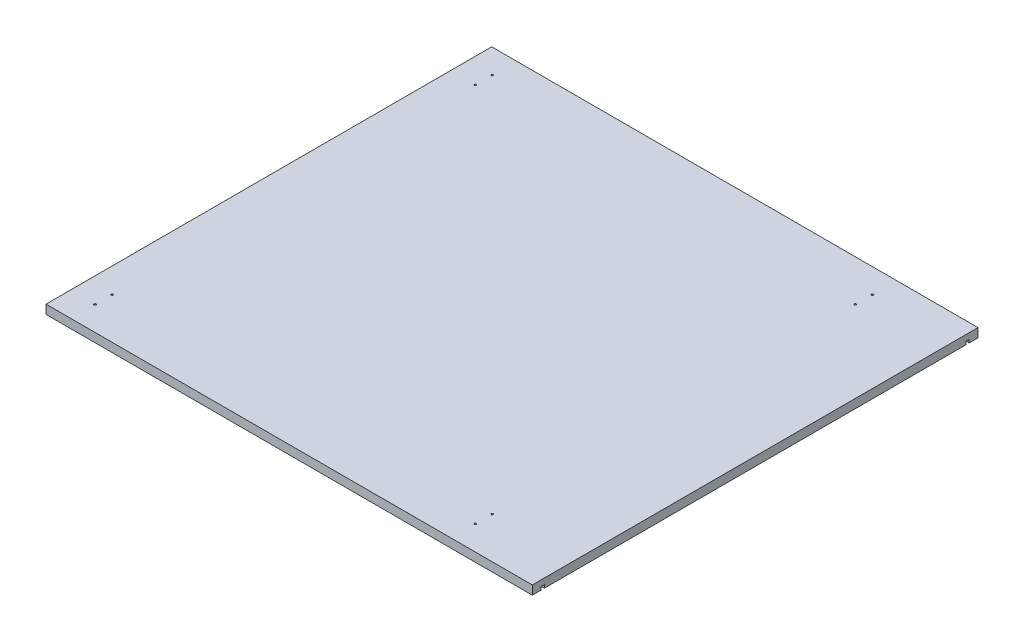
ISO-10303-21;
HEADER;
FILE_DESCRIPTION(('STEP AP214'),'2;1');
FILE_NAME('part.step','',(''),(''),'','','');
FILE_SCHEMA(('AUTOMOTIVE_DESIGN { 1 0 10303 214 1 1 1 1 }'));
ENDSEC;
DATA;
#1=APPLICATION_CONTEXT('core data for automotive mechanical design processes');
#2=APPLICATION_PROTOCOL_DEFINITION('international standard','automotive_design',2000,#1);
#3=PRODUCT_CONTEXT('',#1,'mechanical');
#4=PRODUCT('Part','Part','',(#3));
#5=PRODUCT_RELATED_PRODUCT_CATEGORY('part','',(#4));
#6=PRODUCT_DEFINITION_FORMATION('','',#4);
#7=PRODUCT_DEFINITION_CONTEXT('part definition',#1,'design');
#8=PRODUCT_DEFINITION('design','',#6,#7);
#9=PRODUCT_DEFINITION_SHAPE('','',#8);
#10=(LENGTH_UNIT() NAMED_UNIT(*) SI_UNIT(.MILLI.,.METRE.));
#11=(NAMED_UNIT(*) PLANE_ANGLE_UNIT() SI_UNIT($,.RADIAN.));
#12=(NAMED_UNIT(*) SI_UNIT($,.STERADIAN.) SOLID_ANGLE_UNIT());
#13=UNCERTAINTY_MEASURE_WITH_UNIT(LENGTH_MEASURE(1.E-05),#10,'distance_accuracy_value','');
#14=(GEOMETRIC_REPRESENTATION_CONTEXT(3) GLOBAL_UNCERTAINTY_ASSIGNED_CONTEXT((#13)) GLOBAL_UNIT_ASSIGNED_CONTEXT((#10,
#11,#12)) REPRESENTATION_CONTEXT('',''));
#15=CARTESIAN_POINT('',(0.,0.,0.));
#16=DIRECTION('',(0.,0.,1.));
#17=DIRECTION('',(1.,0.,0.));
#18=AXIS2_PLACEMENT_3D('',#15,#16,#17);
#19=CARTESIAN_POINT('',(0.,0.,0.));
#20=DIRECTION('',(0.,1.,0.));
#21=DIRECTION('',(0.,0.,1.));
#22=AXIS2_PLACEMENT_3D('',#19,#20,#21);
#23=PLANE('',#22);
#24=DIRECTION('',(0.,0.,-1.));
#25=VECTOR('',#24,1.);
#26=CARTESIAN_POINT('',(498.856,0.,457.2));
#27=LINE('',#26,#25);
#28=CARTESIAN_POINT('',(498.856,0.,-438.94375));
#29=VERTEX_POINT('',#28);
#30=CARTESIAN_POINT('',(498.856,0.,-457.2));
#31=VERTEX_POINT('',#30);
#32=EDGE_CURVE('E231',#29,#31,#27,.T.);
#33=ORIENTED_EDGE('',*,*,#32,.F.);
#34=DIRECTION('',(1.,0.,0.));
#35=VECTOR('',#34,1.);
#36=CARTESIAN_POINT('',(-480.59975,0.,-438.94375));
#37=LINE('',#36,#35);
#38=CARTESIAN_POINT('',(-480.59975,0.,-438.94375));
#39=VERTEX_POINT('',#38);
#40=EDGE_CURVE('E154',#39,#29,#37,.T.);
#41=ORIENTED_EDGE('',*,*,#40,.F.);
#42=DIRECTION('',(0.,0.,-1.));
#43=VECTOR('',#42,1.);
#44=CARTESIAN_POINT('',(-480.59975,0.,438.94375));
#45=LINE('',#44,#43);
#46=CARTESIAN_POINT('',(-480.59975,0.,438.94375));
#47=VERTEX_POINT('',#46);
#48=EDGE_CURVE('E176',#47,#39,#45,.T.);
#49=ORIENTED_EDGE('',*,*,#48,.F.);
#50=DIRECTION('',(-1.,0.,0.));
#51=VECTOR('',#50,1.);
#52=CARTESIAN_POINT('',(-480.59975,0.,438.94375));
#53=LINE('',#52,#51);
#54=CARTESIAN_POINT('',(498.856,0.,438.94375));
#55=VERTEX_POINT('',#54);
#56=EDGE_CURVE('E173',#55,#47,#53,.T.);
#57=ORIENTED_EDGE('',*,*,#56,.F.);
#58=CARTESIAN_POINT('',(498.856,0.,457.2));
#59=VERTEX_POINT('',#58);
#60=EDGE_CURVE('E232',#59,#55,#27,.T.);
#61=ORIENTED_EDGE('',*,*,#60,.F.);
#62=DIRECTION('',(1.,0.,0.));
#63=VECTOR('',#62,1.);
#64=CARTESIAN_POINT('',(-498.856,0.,457.2));
#65=LINE('',#64,#63);
#66=CARTESIAN_POINT('',(-498.856,0.,457.2));
#67=VERTEX_POINT('',#66);
#68=EDGE_CURVE('E235',#67,#59,#65,.T.);
#69=ORIENTED_EDGE('',*,*,#68,.F.);
#70=DIRECTION('',(0.,0.,-1.));
#71=VECTOR('',#70,1.);
#72=CARTESIAN_POINT('',(-498.856,0.,457.2));
#73=LINE('',#72,#71);
#74=CARTESIAN_POINT('',(-498.856,0.,-457.2));
#75=VERTEX_POINT('',#74);
#76=EDGE_CURVE('E221',#67,#75,#73,.T.);
#77=ORIENTED_EDGE('',*,*,#76,.T.);
#78=DIRECTION('',(1.,0.,0.));
#79=VECTOR('',#78,1.);
#80=CARTESIAN_POINT('',(-498.856,0.,-457.2));
#81=LINE('',#80,#79);
#82=EDGE_CURVE('E228',#75,#31,#81,.T.);
#83=ORIENTED_EDGE('',*,*,#82,.T.);
#84=EDGE_LOOP('',(#33,#41,#49,#57,#61,#69,#77,#83));
#85=FACE_BOUND('',#84,.T.);
#86=ADVANCED_FACE('F34',(#85),#23,.F.);
#87=CARTESIAN_POINT('',(-498.856,18.25625,-457.2));
#88=DIRECTION('',(0.,0.,-1.));
#89=DIRECTION('',(-1.,0.,0.));
#90=AXIS2_PLACEMENT_3D('',#87,#88,#89);
#91=PLANE('',#90);
#92=ORIENTED_EDGE('',*,*,#82,.F.);
#93=DIRECTION('',(0.,-1.,0.));
#94=VECTOR('',#93,1.);
#95=CARTESIAN_POINT('',(-498.856,18.25625,-457.2));
#96=LINE('',#95,#94);
#97=CARTESIAN_POINT('',(-498.856,18.25625,-457.2));
#98=VERTEX_POINT('',#97);
#99=EDGE_CURVE('E11',#98,#75,#96,.T.);
#100=ORIENTED_EDGE('',*,*,#99,.F.);
#101=DIRECTION('',(1.,0.,0.));
#102=VECTOR('',#101,1.);
#103=CARTESIAN_POINT('',(-498.856,18.25625,-457.2));
#104=LINE('',#103,#102);
#105=CARTESIAN_POINT('',(498.856,18.25625,-457.2));
#106=VERTEX_POINT('',#105);
#107=EDGE_CURVE('E219',#98,#106,#104,.T.);
#108=ORIENTED_EDGE('',*,*,#107,.T.);
#109=DIRECTION('',(0.,-1.,0.));
#110=VECTOR('',#109,1.);
#111=CARTESIAN_POINT('',(498.856,18.25625,-457.2));
#112=LINE('',#111,#110);
#113=EDGE_CURVE('E227',#106,#31,#112,.T.);
#114=ORIENTED_EDGE('',*,*,#113,.T.);
#115=EDGE_LOOP('',(#92,#100,#108,#114));
#116=FACE_BOUND('',#115,.T.);
#117=ADVANCED_FACE('F36',(#116),#91,.T.);
#118=CARTESIAN_POINT('',(-498.856,18.25625,457.2));
#119=DIRECTION('',(-1.,0.,0.));
#120=DIRECTION('',(0.,0.,1.));
#121=AXIS2_PLACEMENT_3D('',#118,#119,#120);
#122=PLANE('',#121);
#123=ORIENTED_EDGE('',*,*,#76,.F.);
#124=DIRECTION('',(0.,-1.,0.));
#125=VECTOR('',#124,1.);
#126=CARTESIAN_POINT('',(-498.856,18.25625,457.2));
#127=LINE('',#126,#125);
#128=CARTESIAN_POINT('',(-498.856,18.25625,457.2));
#129=VERTEX_POINT('',#128);
#130=EDGE_CURVE('E43',#129,#67,#127,.T.);
#131=ORIENTED_EDGE('',*,*,#130,.F.);
#132=DIRECTION('',(0.,0.,-1.));
#133=VECTOR('',#132,1.);
#134=CARTESIAN_POINT('',(-498.856,18.25625,457.2));
#135=LINE('',#134,#133);
#136=EDGE_CURVE('E225',#129,#98,#135,.T.);
#137=ORIENTED_EDGE('',*,*,#136,.T.);
#138=ORIENTED_EDGE('',*,*,#99,.T.);
#139=EDGE_LOOP('',(#123,#131,#137,#138));
#140=FACE_BOUND('',#139,.T.);
#141=ADVANCED_FACE('F292',(#140),#122,.T.);
#142=CARTESIAN_POINT('',(-498.856,18.25625,457.2));
#143=DIRECTION('',(0.,0.,-1.));
#144=DIRECTION('',(-1.,0.,0.));
#145=AXIS2_PLACEMENT_3D('',#142,#143,#144);
#146=PLANE('',#145);
#147=ORIENTED_EDGE('',*,*,#68,.T.);
#148=DIRECTION('',(0.,-1.,0.));
#149=VECTOR('',#148,1.);
#150=CARTESIAN_POINT('',(498.856,18.25625,457.2));
#151=LINE('',#150,#149);
#152=CARTESIAN_POINT('',(498.856,18.25625,457.2));
#153=VERTEX_POINT('',#152);
#154=EDGE_CURVE('E241',#153,#59,#151,.T.);
#155=ORIENTED_EDGE('',*,*,#154,.F.);
#156=DIRECTION('',(1.,0.,0.));
#157=VECTOR('',#156,1.);
#158=CARTESIAN_POINT('',(-498.856,18.25625,457.2));
#159=LINE('',#158,#157);
#160=EDGE_CURVE('E223',#129,#153,#159,.T.);
#161=ORIENTED_EDGE('',*,*,#160,.F.);
#162=ORIENTED_EDGE('',*,*,#130,.T.);
#163=EDGE_LOOP('',(#147,#155,#161,#162));
#164=FACE_BOUND('',#163,.T.);
#165=ADVANCED_FACE('F311',(#164),#146,.F.);
#166=CARTESIAN_POINT('',(498.856,18.25625,457.2));
#167=DIRECTION('',(-1.,0.,0.));
#168=DIRECTION('',(0.,0.,1.));
#169=AXIS2_PLACEMENT_3D('',#166,#167,#168);
#170=PLANE('',#169);
#171=CARTESIAN_POINT('',(498.856,0.,432.59375));
#172=VERTEX_POINT('',#171);
#173=CARTESIAN_POINT('',(498.856,0.,-432.59375));
#174=VERTEX_POINT('',#173);
#175=EDGE_CURVE('E236',#172,#174,#27,.T.);
#176=ORIENTED_EDGE('',*,*,#175,.T.);
#177=DIRECTION('',(0.,-1.,0.));
#178=VECTOR('',#177,1.);
#179=CARTESIAN_POINT('',(498.856,6.35,-432.59375));
#180=LINE('',#179,#178);
#181=CARTESIAN_POINT('',(498.856,6.35,-432.59375));
#182=VERTEX_POINT('',#181);
#183=EDGE_CURVE('E183',#182,#174,#180,.T.);
#184=ORIENTED_EDGE('',*,*,#183,.F.);
#185=DIRECTION('',(0.,0.,1.));
#186=VECTOR('',#185,1.);
#187=CARTESIAN_POINT('',(498.856,6.35,-432.59375));
#188=LINE('',#187,#186);
#189=CARTESIAN_POINT('',(498.856,6.35,-438.94375));
#190=VERTEX_POINT('',#189);
#191=EDGE_CURVE('E167',#190,#182,#188,.T.);
#192=ORIENTED_EDGE('',*,*,#191,.F.);
#193=DIRECTION('',(0.,-1.,0.));
#194=VECTOR('',#193,1.);
#195=CARTESIAN_POINT('',(498.856,6.35,-438.94375));
#196=LINE('',#195,#194);
#197=EDGE_CURVE('E185',#190,#29,#196,.T.);
#198=ORIENTED_EDGE('',*,*,#197,.T.);
#199=ORIENTED_EDGE('',*,*,#32,.T.);
#200=ORIENTED_EDGE('',*,*,#113,.F.);
#201=DIRECTION('',(0.,0.,-1.));
#202=VECTOR('',#201,1.);
#203=CARTESIAN_POINT('',(498.856,18.25625,457.2));
#204=LINE('',#203,#202);
#205=EDGE_CURVE('E84',#153,#106,#204,.T.);
#206=ORIENTED_EDGE('',*,*,#205,.F.);
#207=ORIENTED_EDGE('',*,*,#154,.T.);
#208=ORIENTED_EDGE('',*,*,#60,.T.);
#209=DIRECTION('',(0.,-1.,0.));
#210=VECTOR('',#209,1.);
#211=CARTESIAN_POINT('',(498.856,6.35,438.94375));
#212=LINE('',#211,#210);
#213=CARTESIAN_POINT('',(498.856,6.35,438.94375));
#214=VERTEX_POINT('',#213);
#215=EDGE_CURVE('E192',#214,#55,#212,.T.);
#216=ORIENTED_EDGE('',*,*,#215,.F.);
#217=DIRECTION('',(0.,0.,1.));
#218=VECTOR('',#217,1.);
#219=CARTESIAN_POINT('',(498.856,6.35,438.94375));
#220=LINE('',#219,#218);
#221=CARTESIAN_POINT('',(498.856,6.35,432.59375));
#222=VERTEX_POINT('',#221);
#223=EDGE_CURVE('E147',#222,#214,#220,.T.);
#224=ORIENTED_EDGE('',*,*,#223,.F.);
#225=DIRECTION('',(0.,-1.,0.));
#226=VECTOR('',#225,1.);
#227=CARTESIAN_POINT('',(498.856,6.35,432.59375));
#228=LINE('',#227,#226);
#229=EDGE_CURVE('E137',#222,#172,#228,.T.);
#230=ORIENTED_EDGE('',*,*,#229,.T.);
#231=EDGE_LOOP('',(#176,#184,#192,#198,#199,#200,#206,#207,#208,#216,#224,#230));
#232=FACE_BOUND('',#231,.T.);
#233=ADVANCED_FACE('F306',(#232),#170,.F.);
#234=CARTESIAN_POINT('',(0.,18.25625,0.));
#235=DIRECTION('',(0.,1.,0.));
#236=DIRECTION('',(0.,0.,1.));
#237=AXIS2_PLACEMENT_3D('',#234,#235,#236);
#238=PLANE('',#237);
#239=CARTESIAN_POINT('',(-448.056,18.25625,372.5));
#240=DIRECTION('',(0.,1.,0.));
#241=DIRECTION('',(0.,0.,-1.));
#242=AXIS2_PLACEMENT_3D('',#239,#240,#241);
#243=CIRCLE('',#242,2.);
#244=CARTESIAN_POINT('',(-448.056,18.25625,370.5));
#245=VERTEX_POINT('',#244);
#246=EDGE_CURVE('E201',#245,#245,#243,.T.);
#247=ORIENTED_EDGE('',*,*,#246,.F.);
#248=EDGE_LOOP('',(#247));
#249=FACE_BOUND('',#248,.T.);
#250=CARTESIAN_POINT('',(331.944,18.25625,-407.5));
#251=DIRECTION('',(0.,1.,0.));
#252=DIRECTION('',(0.,0.,-1.));
#253=AXIS2_PLACEMENT_3D('',#250,#251,#252);
#254=CIRCLE('',#253,2.);
#255=CARTESIAN_POINT('',(331.944,18.25625,-409.5));
#256=VERTEX_POINT('',#255);
#257=EDGE_CURVE('E204',#256,#256,#254,.T.);
#258=ORIENTED_EDGE('',*,*,#257,.F.);
#259=EDGE_LOOP('',(#258));
#260=FACE_BOUND('',#259,.T.);
#261=CARTESIAN_POINT('',(-448.056,18.25625,-372.5));
#262=DIRECTION('',(0.,1.,0.));
#263=DIRECTION('',(0.,0.,1.));
#264=AXIS2_PLACEMENT_3D('',#261,#262,#263);
#265=CIRCLE('',#264,2.);
#266=CARTESIAN_POINT('',(-448.056,18.25625,-370.5));
#267=VERTEX_POINT('',#266);
#268=EDGE_CURVE('E207',#267,#267,#265,.T.);
#269=ORIENTED_EDGE('',*,*,#268,.F.);
#270=EDGE_LOOP('',(#269));
#271=FACE_BOUND('',#270,.T.);
#272=CARTESIAN_POINT('',(-448.056,18.25625,-407.5));
#273=DIRECTION('',(0.,1.,0.));
#274=DIRECTION('',(0.,0.,1.));
#275=AXIS2_PLACEMENT_3D('',#272,#273,#274);
#276=CIRCLE('',#275,2.);
#277=CARTESIAN_POINT('',(-448.056,18.25625,-405.5));
#278=VERTEX_POINT('',#277);
#279=EDGE_CURVE('E210',#278,#278,#276,.T.);
#280=ORIENTED_EDGE('',*,*,#279,.F.);
#281=EDGE_LOOP('',(#280));
#282=FACE_BOUND('',#281,.T.);
#283=CARTESIAN_POINT('',(331.944,18.25625,407.5));
#284=DIRECTION('',(0.,1.,0.));
#285=DIRECTION('',(0.,0.,1.));
#286=AXIS2_PLACEMENT_3D('',#283,#284,#285);
#287=CIRCLE('',#286,2.);
#288=CARTESIAN_POINT('',(331.944,18.25625,409.5));
#289=VERTEX_POINT('',#288);
#290=EDGE_CURVE('E182',#289,#289,#287,.T.);
#291=ORIENTED_EDGE('',*,*,#290,.F.);
#292=EDGE_LOOP('',(#291));
#293=FACE_BOUND('',#292,.T.);
#294=CARTESIAN_POINT('',(331.944,18.25625,372.5));
#295=DIRECTION('',(0.,1.,0.));
#296=DIRECTION('',(0.,0.,1.));
#297=AXIS2_PLACEMENT_3D('',#294,#295,#296);
#298=CIRCLE('',#297,2.);
#299=CARTESIAN_POINT('',(331.944,18.25625,374.5));
#300=VERTEX_POINT('',#299);
#301=EDGE_CURVE('E197',#300,#300,#298,.T.);
#302=ORIENTED_EDGE('',*,*,#301,.F.);
#303=EDGE_LOOP('',(#302));
#304=FACE_BOUND('',#303,.T.);
#305=CARTESIAN_POINT('',(-448.056,18.25625,407.5));
#306=DIRECTION('',(0.,1.,0.));
#307=DIRECTION('',(0.,0.,-1.));
#308=AXIS2_PLACEMENT_3D('',#305,#306,#307);
#309=CIRCLE('',#308,2.);
#310=CARTESIAN_POINT('',(-448.056,18.25625,405.5));
#311=VERTEX_POINT('',#310);
#312=EDGE_CURVE('E198',#311,#311,#309,.T.);
#313=ORIENTED_EDGE('',*,*,#312,.F.);
#314=EDGE_LOOP('',(#313));
#315=FACE_BOUND('',#314,.T.);
#316=CARTESIAN_POINT('',(331.944,18.25625,-372.5));
#317=DIRECTION('',(0.,1.,0.));
#318=DIRECTION('',(0.,0.,-1.));
#319=AXIS2_PLACEMENT_3D('',#316,#317,#318);
#320=CIRCLE('',#319,2.);
#321=CARTESIAN_POINT('',(331.944,18.25625,-374.5));
#322=VERTEX_POINT('',#321);
#323=EDGE_CURVE('E213',#322,#322,#320,.T.);
#324=ORIENTED_EDGE('',*,*,#323,.F.);
#325=EDGE_LOOP('',(#324));
#326=FACE_BOUND('',#325,.T.);
#327=ORIENTED_EDGE('',*,*,#107,.F.);
#328=ORIENTED_EDGE('',*,*,#136,.F.);
#329=ORIENTED_EDGE('',*,*,#160,.T.);
#330=ORIENTED_EDGE('',*,*,#205,.T.);
#331=EDGE_LOOP('',(#327,#328,#329,#330));
#332=FACE_BOUND('',#331,.T.);
#333=ADVANCED_FACE('F298',(#249,#260,#271,#282,#293,#304,#315,#326,#332),#238,.T.);
#334=CARTESIAN_POINT('',(-448.056,0.,372.5));
#335=DIRECTION('',(0.,1.,0.));
#336=DIRECTION('',(0.,0.,1.));
#337=AXIS2_PLACEMENT_3D('',#334,#335,#336);
#338=CIRCLE('',#337,2.);
#339=CARTESIAN_POINT('',(-448.056,0.,374.5));
#340=VERTEX_POINT('',#339);
#341=EDGE_CURVE('E38',#340,#340,#338,.T.);
#342=ORIENTED_EDGE('',*,*,#341,.T.);
#343=EDGE_LOOP('',(#342));
#344=FACE_BOUND('',#343,.T.);
#345=CARTESIAN_POINT('',(331.944,0.,-407.5));
#346=DIRECTION('',(0.,1.,0.));
#347=DIRECTION('',(0.,0.,1.));
#348=AXIS2_PLACEMENT_3D('',#345,#346,#347);
#349=CIRCLE('',#348,2.);
#350=CARTESIAN_POINT('',(331.944,0.,-405.5));
#351=VERTEX_POINT('',#350);
#352=EDGE_CURVE('E262',#351,#351,#349,.T.);
#353=ORIENTED_EDGE('',*,*,#352,.T.);
#354=EDGE_LOOP('',(#353));
#355=FACE_BOUND('',#354,.T.);
#356=CARTESIAN_POINT('',(-448.056,0.,-372.5));
#357=DIRECTION('',(0.,1.,0.));
#358=DIRECTION('',(0.,0.,1.));
#359=AXIS2_PLACEMENT_3D('',#356,#357,#358);
#360=CIRCLE('',#359,2.);
#361=CARTESIAN_POINT('',(-448.056,0.,-370.5));
#362=VERTEX_POINT('',#361);
#363=EDGE_CURVE('E260',#362,#362,#360,.T.);
#364=ORIENTED_EDGE('',*,*,#363,.T.);
#365=EDGE_LOOP('',(#364));
#366=FACE_BOUND('',#365,.T.);
#367=CARTESIAN_POINT('',(-448.056,0.,-407.5));
#368=DIRECTION('',(0.,1.,0.));
#369=DIRECTION('',(0.,0.,1.));
#370=AXIS2_PLACEMENT_3D('',#367,#368,#369);
#371=CIRCLE('',#370,2.);
#372=CARTESIAN_POINT('',(-448.056,0.,-405.5));
#373=VERTEX_POINT('',#372);
#374=EDGE_CURVE('E257',#373,#373,#371,.T.);
#375=ORIENTED_EDGE('',*,*,#374,.T.);
#376=EDGE_LOOP('',(#375));
#377=FACE_BOUND('',#376,.T.);
#378=CARTESIAN_POINT('',(331.944,0.,407.5));
#379=DIRECTION('',(0.,1.,0.));
#380=DIRECTION('',(0.,0.,1.));
#381=AXIS2_PLACEMENT_3D('',#378,#379,#380);
#382=CIRCLE('',#381,2.);
#383=CARTESIAN_POINT('',(331.944,0.,409.5));
#384=VERTEX_POINT('',#383);
#385=EDGE_CURVE('E254',#384,#384,#382,.T.);
#386=ORIENTED_EDGE('',*,*,#385,.T.);
#387=EDGE_LOOP('',(#386));
#388=FACE_BOUND('',#387,.T.);
#389=CARTESIAN_POINT('',(331.944,0.,372.5));
#390=DIRECTION('',(0.,1.,0.));
#391=DIRECTION('',(0.,0.,1.));
#392=AXIS2_PLACEMENT_3D('',#389,#390,#391);
#393=CIRCLE('',#392,2.);
#394=CARTESIAN_POINT('',(331.944,0.,374.5));
#395=VERTEX_POINT('',#394);
#396=EDGE_CURVE('E251',#395,#395,#393,.T.);
#397=ORIENTED_EDGE('',*,*,#396,.T.);
#398=EDGE_LOOP('',(#397));
#399=FACE_BOUND('',#398,.T.);
#400=CARTESIAN_POINT('',(-448.056,0.,407.5));
#401=DIRECTION('',(0.,1.,0.));
#402=DIRECTION('',(0.,0.,1.));
#403=AXIS2_PLACEMENT_3D('',#400,#401,#402);
#404=CIRCLE('',#403,2.);
#405=CARTESIAN_POINT('',(-448.056,0.,409.5));
#406=VERTEX_POINT('',#405);
#407=EDGE_CURVE('E248',#406,#406,#404,.T.);
#408=ORIENTED_EDGE('',*,*,#407,.T.);
#409=EDGE_LOOP('',(#408));
#410=FACE_BOUND('',#409,.T.);
#411=CARTESIAN_POINT('',(331.944,0.,-372.5));
#412=DIRECTION('',(0.,1.,0.));
#413=DIRECTION('',(0.,0.,1.));
#414=AXIS2_PLACEMENT_3D('',#411,#412,#413);
#415=CIRCLE('',#414,2.);
#416=CARTESIAN_POINT('',(331.944,0.,-370.5));
#417=VERTEX_POINT('',#416);
#418=EDGE_CURVE('E218',#417,#417,#415,.T.);
#419=ORIENTED_EDGE('',*,*,#418,.T.);
#420=EDGE_LOOP('',(#419));
#421=FACE_BOUND('',#420,.T.);
#422=DIRECTION('',(0.,0.,1.));
#423=VECTOR('',#422,1.);
#424=CARTESIAN_POINT('',(-474.24975,0.,432.59375));
#425=LINE('',#424,#423);
#426=CARTESIAN_POINT('',(-474.24975,0.,-432.59375));
#427=VERTEX_POINT('',#426);
#428=CARTESIAN_POINT('',(-474.24975,0.,432.59375));
#429=VERTEX_POINT('',#428);
#430=EDGE_CURVE('E51',#427,#429,#425,.T.);
#431=ORIENTED_EDGE('',*,*,#430,.F.);
#432=DIRECTION('',(-1.,0.,0.));
#433=VECTOR('',#432,1.);
#434=CARTESIAN_POINT('',(-474.24975,0.,-432.59375));
#435=LINE('',#434,#433);
#436=EDGE_CURVE('E151',#174,#427,#435,.T.);
#437=ORIENTED_EDGE('',*,*,#436,.F.);
#438=ORIENTED_EDGE('',*,*,#175,.F.);
#439=DIRECTION('',(1.,0.,0.));
#440=VECTOR('',#439,1.);
#441=CARTESIAN_POINT('',(-474.24975,0.,432.59375));
#442=LINE('',#441,#440);
#443=EDGE_CURVE('E171',#429,#172,#442,.T.);
#444=ORIENTED_EDGE('',*,*,#443,.F.);
#445=EDGE_LOOP('',(#431,#437,#438,#444));
#446=FACE_BOUND('',#445,.T.);
#447=ADVANCED_FACE('F269',(#344,#355,#366,#377,#388,#399,#410,#421,#446),#23,.F.);
#448=CARTESIAN_POINT('',(331.944,-32.54375,-372.5));
#449=DIRECTION('',(0.,1.,0.));
#450=DIRECTION('',(0.,0.,1.));
#451=AXIS2_PLACEMENT_3D('',#448,#449,#450);
#452=CYLINDRICAL_SURFACE('',#451,2.);
#453=ORIENTED_EDGE('',*,*,#323,.T.);
#454=EDGE_LOOP('',(#453));
#455=FACE_BOUND('',#454,.T.);
#456=ORIENTED_EDGE('',*,*,#418,.F.);
#457=EDGE_LOOP('',(#456));
#458=FACE_BOUND('',#457,.T.);
#459=ADVANCED_FACE('F297',(#455,#458),#452,.F.);
#460=CARTESIAN_POINT('',(-448.056,-32.54375,407.5));
#461=DIRECTION('',(0.,1.,0.));
#462=DIRECTION('',(0.,0.,1.));
#463=AXIS2_PLACEMENT_3D('',#460,#461,#462);
#464=CYLINDRICAL_SURFACE('',#463,2.);
#465=ORIENTED_EDGE('',*,*,#312,.T.);
#466=EDGE_LOOP('',(#465));
#467=FACE_BOUND('',#466,.T.);
#468=ORIENTED_EDGE('',*,*,#407,.F.);
#469=EDGE_LOOP('',(#468));
#470=FACE_BOUND('',#469,.T.);
#471=ADVANCED_FACE('F303',(#467,#470),#464,.F.);
#472=CARTESIAN_POINT('',(331.944,-32.54375,372.5));
#473=DIRECTION('',(0.,1.,0.));
#474=DIRECTION('',(0.,0.,1.));
#475=AXIS2_PLACEMENT_3D('',#472,#473,#474);
#476=CYLINDRICAL_SURFACE('',#475,2.);
#477=ORIENTED_EDGE('',*,*,#301,.T.);
#478=EDGE_LOOP('',(#477));
#479=FACE_BOUND('',#478,.T.);
#480=ORIENTED_EDGE('',*,*,#396,.F.);
#481=EDGE_LOOP('',(#480));
#482=FACE_BOUND('',#481,.T.);
#483=ADVANCED_FACE('F325',(#479,#482),#476,.F.);
#484=CARTESIAN_POINT('',(331.944,-32.54375,407.5));
#485=DIRECTION('',(0.,1.,0.));
#486=DIRECTION('',(0.,0.,1.));
#487=AXIS2_PLACEMENT_3D('',#484,#485,#486);
#488=CYLINDRICAL_SURFACE('',#487,2.);
#489=ORIENTED_EDGE('',*,*,#290,.T.);
#490=EDGE_LOOP('',(#489));
#491=FACE_BOUND('',#490,.T.);
#492=ORIENTED_EDGE('',*,*,#385,.F.);
#493=EDGE_LOOP('',(#492));
#494=FACE_BOUND('',#493,.T.);
#495=ADVANCED_FACE('F320',(#491,#494),#488,.F.);
#496=CARTESIAN_POINT('',(-448.056,-32.54375,-407.5));
#497=DIRECTION('',(0.,1.,0.));
#498=DIRECTION('',(0.,0.,1.));
#499=AXIS2_PLACEMENT_3D('',#496,#497,#498);
#500=CYLINDRICAL_SURFACE('',#499,2.);
#501=ORIENTED_EDGE('',*,*,#279,.T.);
#502=EDGE_LOOP('',(#501));
#503=FACE_BOUND('',#502,.T.);
#504=ORIENTED_EDGE('',*,*,#374,.F.);
#505=EDGE_LOOP('',(#504));
#506=FACE_BOUND('',#505,.T.);
#507=ADVANCED_FACE('F317',(#503,#506),#500,.F.);
#508=CARTESIAN_POINT('',(-448.056,-32.54375,-372.5));
#509=DIRECTION('',(0.,1.,0.));
#510=DIRECTION('',(0.,0.,1.));
#511=AXIS2_PLACEMENT_3D('',#508,#509,#510);
#512=CYLINDRICAL_SURFACE('',#511,2.);
#513=ORIENTED_EDGE('',*,*,#268,.T.);
#514=EDGE_LOOP('',(#513));
#515=FACE_BOUND('',#514,.T.);
#516=ORIENTED_EDGE('',*,*,#363,.F.);
#517=EDGE_LOOP('',(#516));
#518=FACE_BOUND('',#517,.T.);
#519=ADVANCED_FACE('F282',(#515,#518),#512,.F.);
#520=CARTESIAN_POINT('',(331.944,-32.54375,-407.5));
#521=DIRECTION('',(0.,1.,0.));
#522=DIRECTION('',(0.,0.,1.));
#523=AXIS2_PLACEMENT_3D('',#520,#521,#522);
#524=CYLINDRICAL_SURFACE('',#523,2.);
#525=ORIENTED_EDGE('',*,*,#257,.T.);
#526=EDGE_LOOP('',(#525));
#527=FACE_BOUND('',#526,.T.);
#528=ORIENTED_EDGE('',*,*,#352,.F.);
#529=EDGE_LOOP('',(#528));
#530=FACE_BOUND('',#529,.T.);
#531=ADVANCED_FACE('F273',(#527,#530),#524,.F.);
#532=CARTESIAN_POINT('',(-448.056,-32.54375,372.5));
#533=DIRECTION('',(0.,1.,0.));
#534=DIRECTION('',(0.,0.,1.));
#535=AXIS2_PLACEMENT_3D('',#532,#533,#534);
#536=CYLINDRICAL_SURFACE('',#535,2.);
#537=ORIENTED_EDGE('',*,*,#246,.T.);
#538=EDGE_LOOP('',(#537));
#539=FACE_BOUND('',#538,.T.);
#540=ORIENTED_EDGE('',*,*,#341,.F.);
#541=EDGE_LOOP('',(#540));
#542=FACE_BOUND('',#541,.T.);
#543=ADVANCED_FACE('F271',(#539,#542),#536,.F.);
#544=CARTESIAN_POINT('',(-474.24975,6.35,432.59375));
#545=DIRECTION('',(1.,0.,0.));
#546=DIRECTION('',(0.,0.,-1.));
#547=AXIS2_PLACEMENT_3D('',#544,#545,#546);
#548=PLANE('',#547);
#549=ORIENTED_EDGE('',*,*,#430,.T.);
#550=DIRECTION('',(0.,-1.,0.));
#551=VECTOR('',#550,1.);
#552=CARTESIAN_POINT('',(-474.24975,6.35,432.59375));
#553=LINE('',#552,#551);
#554=CARTESIAN_POINT('',(-474.24975,6.35,432.59375));
#555=VERTEX_POINT('',#554);
#556=EDGE_CURVE('E129',#555,#429,#553,.T.);
#557=ORIENTED_EDGE('',*,*,#556,.F.);
#558=DIRECTION('',(0.,0.,1.));
#559=VECTOR('',#558,1.);
#560=CARTESIAN_POINT('',(-474.24975,6.35,432.59375));
#561=LINE('',#560,#559);
#562=CARTESIAN_POINT('',(-474.24975,6.35,-432.59375));
#563=VERTEX_POINT('',#562);
#564=EDGE_CURVE('E133',#563,#555,#561,.T.);
#565=ORIENTED_EDGE('',*,*,#564,.F.);
#566=DIRECTION('',(0.,-1.,0.));
#567=VECTOR('',#566,1.);
#568=CARTESIAN_POINT('',(-474.24975,6.35,-432.59375));
#569=LINE('',#568,#567);
#570=EDGE_CURVE('E180',#563,#427,#569,.T.);
#571=ORIENTED_EDGE('',*,*,#570,.T.);
#572=EDGE_LOOP('',(#549,#557,#565,#571));
#573=FACE_BOUND('',#572,.T.);
#574=ADVANCED_FACE('F131',(#573),#548,.F.);
#575=CARTESIAN_POINT('',(-474.24975,6.35,-432.59375));
#576=DIRECTION('',(0.,0.,1.));
#577=DIRECTION('',(1.,0.,0.));
#578=AXIS2_PLACEMENT_3D('',#575,#576,#577);
#579=PLANE('',#578);
#580=ORIENTED_EDGE('',*,*,#436,.T.);
#581=ORIENTED_EDGE('',*,*,#570,.F.);
#582=DIRECTION('',(-1.,0.,0.));
#583=VECTOR('',#582,1.);
#584=CARTESIAN_POINT('',(-474.24975,6.35,-432.59375));
#585=LINE('',#584,#583);
#586=EDGE_CURVE('E138',#182,#563,#585,.T.);
#587=ORIENTED_EDGE('',*,*,#586,.F.);
#588=ORIENTED_EDGE('',*,*,#183,.T.);
#589=EDGE_LOOP('',(#580,#581,#587,#588));
#590=FACE_BOUND('',#589,.T.);
#591=ADVANCED_FACE('F280',(#590),#579,.F.);
#592=CARTESIAN_POINT('',(-480.59975,6.35,-438.94375));
#593=DIRECTION('',(0.,0.,-1.));
#594=DIRECTION('',(-1.,0.,0.));
#595=AXIS2_PLACEMENT_3D('',#592,#593,#594);
#596=PLANE('',#595);
#597=ORIENTED_EDGE('',*,*,#40,.T.);
#598=ORIENTED_EDGE('',*,*,#197,.F.);
#599=DIRECTION('',(1.,0.,0.));
#600=VECTOR('',#599,1.);
#601=CARTESIAN_POINT('',(-480.59975,6.35,-438.94375));
#602=LINE('',#601,#600);
#603=CARTESIAN_POINT('',(-480.59975,6.35,-438.94375));
#604=VERTEX_POINT('',#603);
#605=EDGE_CURVE('E164',#604,#190,#602,.T.);
#606=ORIENTED_EDGE('',*,*,#605,.F.);
#607=DIRECTION('',(0.,-1.,0.));
#608=VECTOR('',#607,1.);
#609=CARTESIAN_POINT('',(-480.59975,6.35,-438.94375));
#610=LINE('',#609,#608);
#611=EDGE_CURVE('E188',#604,#39,#610,.T.);
#612=ORIENTED_EDGE('',*,*,#611,.T.);
#613=EDGE_LOOP('',(#597,#598,#606,#612));
#614=FACE_BOUND('',#613,.T.);
#615=ADVANCED_FACE('F356',(#614),#596,.F.);
#616=CARTESIAN_POINT('',(-480.59975,6.35,438.94375));
#617=DIRECTION('',(-1.,0.,0.));
#618=DIRECTION('',(0.,0.,1.));
#619=AXIS2_PLACEMENT_3D('',#616,#617,#618);
#620=PLANE('',#619);
#621=ORIENTED_EDGE('',*,*,#48,.T.);
#622=ORIENTED_EDGE('',*,*,#611,.F.);
#623=DIRECTION('',(0.,0.,-1.));
#624=VECTOR('',#623,1.);
#625=CARTESIAN_POINT('',(-480.59975,6.35,438.94375));
#626=LINE('',#625,#624);
#627=CARTESIAN_POINT('',(-480.59975,6.35,438.94375));
#628=VERTEX_POINT('',#627);
#629=EDGE_CURVE('E161',#628,#604,#626,.T.);
#630=ORIENTED_EDGE('',*,*,#629,.F.);
#631=DIRECTION('',(0.,-1.,0.));
#632=VECTOR('',#631,1.);
#633=CARTESIAN_POINT('',(-480.59975,6.35,438.94375));
#634=LINE('',#633,#632);
#635=EDGE_CURVE('E190',#628,#47,#634,.T.);
#636=ORIENTED_EDGE('',*,*,#635,.T.);
#637=EDGE_LOOP('',(#621,#622,#630,#636));
#638=FACE_BOUND('',#637,.T.);
#639=ADVANCED_FACE('F352',(#638),#620,.F.);
#640=CARTESIAN_POINT('',(-480.59975,6.35,438.94375));
#641=DIRECTION('',(0.,0.,1.));
#642=DIRECTION('',(1.,0.,0.));
#643=AXIS2_PLACEMENT_3D('',#640,#641,#642);
#644=PLANE('',#643);
#645=ORIENTED_EDGE('',*,*,#56,.T.);
#646=ORIENTED_EDGE('',*,*,#635,.F.);
#647=DIRECTION('',(-1.,0.,0.));
#648=VECTOR('',#647,1.);
#649=CARTESIAN_POINT('',(-480.59975,6.35,438.94375));
#650=LINE('',#649,#648);
#651=EDGE_CURVE('E158',#214,#628,#650,.T.);
#652=ORIENTED_EDGE('',*,*,#651,.F.);
#653=ORIENTED_EDGE('',*,*,#215,.T.);
#654=EDGE_LOOP('',(#645,#646,#652,#653));
#655=FACE_BOUND('',#654,.T.);
#656=ADVANCED_FACE('F348',(#655),#644,.F.);
#657=CARTESIAN_POINT('',(-474.24975,6.35,432.59375));
#658=DIRECTION('',(0.,0.,-1.));
#659=DIRECTION('',(-1.,0.,0.));
#660=AXIS2_PLACEMENT_3D('',#657,#658,#659);
#661=PLANE('',#660);
#662=ORIENTED_EDGE('',*,*,#443,.T.);
#663=ORIENTED_EDGE('',*,*,#229,.F.);
#664=DIRECTION('',(1.,0.,0.));
#665=VECTOR('',#664,1.);
#666=CARTESIAN_POINT('',(-474.24975,6.35,432.59375));
#667=LINE('',#666,#665);
#668=EDGE_CURVE('E141',#555,#222,#667,.T.);
#669=ORIENTED_EDGE('',*,*,#668,.F.);
#670=ORIENTED_EDGE('',*,*,#556,.T.);
#671=EDGE_LOOP('',(#662,#663,#669,#670));
#672=FACE_BOUND('',#671,.T.);
#673=ADVANCED_FACE('F142',(#672),#661,.F.);
#674=CARTESIAN_POINT('',(0.,6.35,0.));
#675=DIRECTION('',(0.,-1.,0.));
#676=DIRECTION('',(0.,0.,-1.));
#677=AXIS2_PLACEMENT_3D('',#674,#675,#676);
#678=PLANE('',#677);
#679=ORIENTED_EDGE('',*,*,#564,.T.);
#680=ORIENTED_EDGE('',*,*,#668,.T.);
#681=ORIENTED_EDGE('',*,*,#223,.T.);
#682=ORIENTED_EDGE('',*,*,#651,.T.);
#683=ORIENTED_EDGE('',*,*,#629,.T.);
#684=ORIENTED_EDGE('',*,*,#605,.T.);
#685=ORIENTED_EDGE('',*,*,#191,.T.);
#686=ORIENTED_EDGE('',*,*,#586,.T.);
#687=EDGE_LOOP('',(#679,#680,#681,#682,#683,#684,#685,#686));
#688=FACE_BOUND('',#687,.T.);
#689=ADVANCED_FACE('F149',(#688),#678,.T.);
#690=CLOSED_SHELL('',(#86,#117,#141,#165,#233,#333,#447,#459,#471,#483,#495,#507,#519,#531,#543,
#574,#591,#615,#639,#656,#673,#689));
#691=MANIFOLD_SOLID_BREP('B2',#690);
#692=ADVANCED_BREP_SHAPE_REPRESENTATION('',(#18,#691),#14);
#693=SHAPE_DEFINITION_REPRESENTATION(#9,#692);
ENDSEC;
END-ISO-10303-21;
